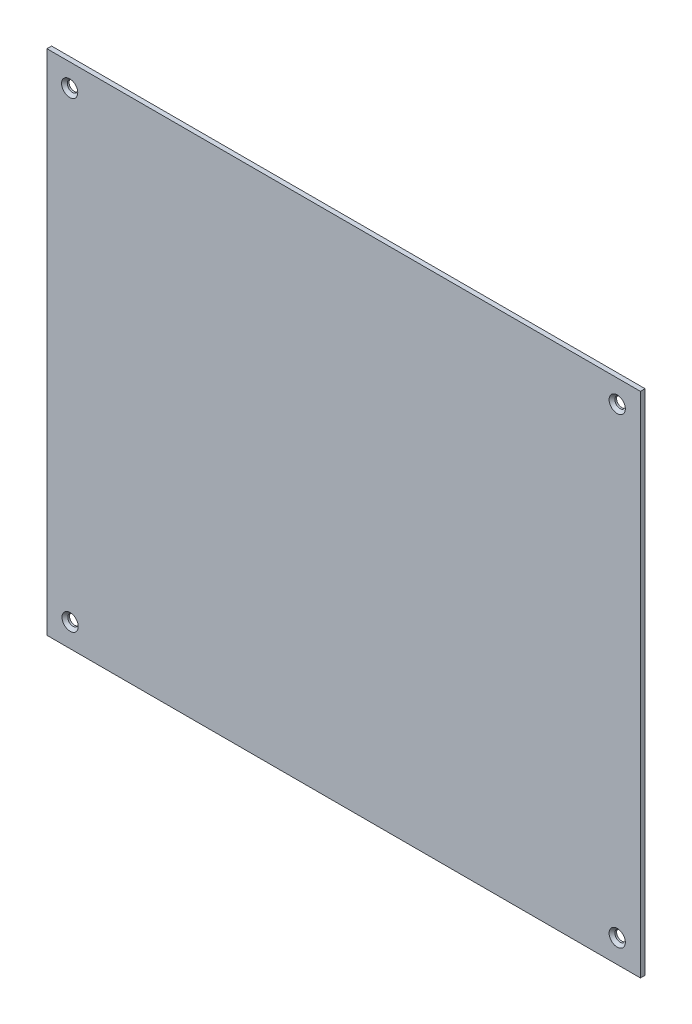
ISO-10303-21;
HEADER;
FILE_DESCRIPTION(('STEP AP214'),'2;1');
FILE_NAME('part.step','',(''),(''),'','','');
FILE_SCHEMA(('AUTOMOTIVE_DESIGN { 1 0 10303 214 1 1 1 1 }'));
ENDSEC;
DATA;
#1=APPLICATION_CONTEXT('core data for automotive mechanical design processes');
#2=APPLICATION_PROTOCOL_DEFINITION('international standard','automotive_design',2000,#1);
#3=PRODUCT_CONTEXT('',#1,'mechanical');
#4=PRODUCT('Part','Part','',(#3));
#5=PRODUCT_RELATED_PRODUCT_CATEGORY('part','',(#4));
#6=PRODUCT_DEFINITION_FORMATION('','',#4);
#7=PRODUCT_DEFINITION_CONTEXT('part definition',#1,'design');
#8=PRODUCT_DEFINITION('design','',#6,#7);
#9=PRODUCT_DEFINITION_SHAPE('','',#8);
#10=(LENGTH_UNIT() NAMED_UNIT(*) SI_UNIT(.MILLI.,.METRE.));
#11=(NAMED_UNIT(*) PLANE_ANGLE_UNIT() SI_UNIT($,.RADIAN.));
#12=(NAMED_UNIT(*) SI_UNIT($,.STERADIAN.) SOLID_ANGLE_UNIT());
#13=UNCERTAINTY_MEASURE_WITH_UNIT(LENGTH_MEASURE(1.E-05),#10,'distance_accuracy_value','');
#14=(GEOMETRIC_REPRESENTATION_CONTEXT(3) GLOBAL_UNCERTAINTY_ASSIGNED_CONTEXT((#13)) GLOBAL_UNIT_ASSIGNED_CONTEXT((#10,
#11,#12)) REPRESENTATION_CONTEXT('',''));
#15=CARTESIAN_POINT('',(0.,0.,0.));
#16=DIRECTION('',(0.,0.,1.));
#17=DIRECTION('',(1.,0.,0.));
#18=AXIS2_PLACEMENT_3D('',#15,#16,#17);
#19=CARTESIAN_POINT('',(0.,0.,1.905));
#20=DIRECTION('',(0.,0.,-1.));
#21=DIRECTION('',(-1.,0.,0.));
#22=AXIS2_PLACEMENT_3D('',#19,#20,#21);
#23=PLANE('',#22);
#24=DIRECTION('',(0.,-1.,0.));
#25=VECTOR('',#24,1.);
#26=CARTESIAN_POINT('',(0.,0.,1.905));
#27=LINE('',#26,#25);
#28=CARTESIAN_POINT('',(0.,208.28,1.905));
#29=VERTEX_POINT('',#28);
#30=CARTESIAN_POINT('',(0.,0.,1.905));
#31=VERTEX_POINT('',#30);
#32=EDGE_CURVE('E91',#29,#31,#27,.T.);
#33=ORIENTED_EDGE('',*,*,#32,.T.);
#34=DIRECTION('',(1.,0.,0.));
#35=VECTOR('',#34,1.);
#36=CARTESIAN_POINT('',(0.,0.,1.905));
#37=LINE('',#36,#35);
#38=CARTESIAN_POINT('',(243.332,0.,1.905));
#39=VERTEX_POINT('',#38);
#40=EDGE_CURVE('E86',#31,#39,#37,.T.);
#41=ORIENTED_EDGE('',*,*,#40,.T.);
#42=DIRECTION('',(0.,1.,0.));
#43=VECTOR('',#42,1.);
#44=CARTESIAN_POINT('',(243.332,0.,1.905));
#45=LINE('',#44,#43);
#46=CARTESIAN_POINT('',(243.332,208.28,1.905));
#47=VERTEX_POINT('',#46);
#48=EDGE_CURVE('E89',#39,#47,#45,.T.);
#49=ORIENTED_EDGE('',*,*,#48,.T.);
#50=DIRECTION('',(-1.,0.,0.));
#51=VECTOR('',#50,1.);
#52=CARTESIAN_POINT('',(0.,208.28,1.905));
#53=LINE('',#52,#51);
#54=EDGE_CURVE('E56',#47,#29,#53,.T.);
#55=ORIENTED_EDGE('',*,*,#54,.T.);
#56=EDGE_LOOP('',(#33,#41,#49,#55));
#57=FACE_BOUND('',#56,.T.);
#58=CARTESIAN_POINT('',(233.807,198.955000999999,1.905));
#59=DIRECTION('',(0.,0.,1.));
#60=DIRECTION('',(1.,0.,0.));
#61=AXIS2_PLACEMENT_3D('',#58,#59,#60);
#62=CIRCLE('',#61,3.32740000000001);
#63=CARTESIAN_POINT('',(237.1344,198.955000999999,1.905));
#64=VERTEX_POINT('',#63);
#65=EDGE_CURVE('E122',#64,#64,#62,.T.);
#66=ORIENTED_EDGE('',*,*,#65,.F.);
#67=EDGE_LOOP('',(#66));
#68=FACE_BOUND('',#67,.T.);
#69=CARTESIAN_POINT('',(9.525,9.525,1.905));
#70=DIRECTION('',(0.,0.,1.));
#71=DIRECTION('',(1.,0.,0.));
#72=AXIS2_PLACEMENT_3D('',#69,#70,#71);
#73=CIRCLE('',#72,3.3274);
#74=CARTESIAN_POINT('',(12.8524,9.525,1.905));
#75=VERTEX_POINT('',#74);
#76=EDGE_CURVE('E131',#75,#75,#73,.T.);
#77=ORIENTED_EDGE('',*,*,#76,.F.);
#78=EDGE_LOOP('',(#77));
#79=FACE_BOUND('',#78,.T.);
#80=CARTESIAN_POINT('',(233.807,9.525,1.905));
#81=DIRECTION('',(0.,0.,1.));
#82=DIRECTION('',(1.,0.,0.));
#83=AXIS2_PLACEMENT_3D('',#80,#81,#82);
#84=CIRCLE('',#83,3.32740000000001);
#85=CARTESIAN_POINT('',(237.1344,9.525,1.905));
#86=VERTEX_POINT('',#85);
#87=EDGE_CURVE('E140',#86,#86,#84,.T.);
#88=ORIENTED_EDGE('',*,*,#87,.F.);
#89=EDGE_LOOP('',(#88));
#90=FACE_BOUND('',#89,.T.);
#91=CARTESIAN_POINT('',(9.32499900000117,198.955000999999,1.905));
#92=DIRECTION('',(0.,0.,1.));
#93=DIRECTION('',(1.,0.,0.));
#94=AXIS2_PLACEMENT_3D('',#91,#92,#93);
#95=CIRCLE('',#94,3.3274);
#96=CARTESIAN_POINT('',(12.6523990000012,198.955000999999,1.905));
#97=VERTEX_POINT('',#96);
#98=EDGE_CURVE('E149',#97,#97,#95,.T.);
#99=ORIENTED_EDGE('',*,*,#98,.F.);
#100=EDGE_LOOP('',(#99));
#101=FACE_BOUND('',#100,.T.);
#102=ADVANCED_FACE('F39',(#57,#68,#79,#90,#101),#23,.F.);
#103=CARTESIAN_POINT('',(0.,0.,1.905));
#104=DIRECTION('',(1.,0.,0.));
#105=DIRECTION('',(0.,0.,-1.));
#106=AXIS2_PLACEMENT_3D('',#103,#104,#105);
#107=PLANE('',#106);
#108=DIRECTION('',(0.,-1.,0.));
#109=VECTOR('',#108,1.);
#110=CARTESIAN_POINT('',(0.,0.,0.));
#111=LINE('',#110,#109);
#112=CARTESIAN_POINT('',(0.,208.28,0.));
#113=VERTEX_POINT('',#112);
#114=CARTESIAN_POINT('',(0.,0.,0.));
#115=VERTEX_POINT('',#114);
#116=EDGE_CURVE('E103',#113,#115,#111,.T.);
#117=ORIENTED_EDGE('',*,*,#116,.T.);
#118=DIRECTION('',(0.,0.,-1.));
#119=VECTOR('',#118,1.);
#120=CARTESIAN_POINT('',(0.,0.,1.905));
#121=LINE('',#120,#119);
#122=EDGE_CURVE('E11',#31,#115,#121,.T.);
#123=ORIENTED_EDGE('',*,*,#122,.F.);
#124=ORIENTED_EDGE('',*,*,#32,.F.);
#125=DIRECTION('',(0.,0.,-1.));
#126=VECTOR('',#125,1.);
#127=CARTESIAN_POINT('',(0.,208.28,1.905));
#128=LINE('',#127,#126);
#129=EDGE_CURVE('E99',#29,#113,#128,.T.);
#130=ORIENTED_EDGE('',*,*,#129,.T.);
#131=EDGE_LOOP('',(#117,#123,#124,#130));
#132=FACE_BOUND('',#131,.T.);
#133=ADVANCED_FACE('F41',(#132),#107,.F.);
#134=CARTESIAN_POINT('',(0.,0.,1.905));
#135=DIRECTION('',(0.,1.,0.));
#136=DIRECTION('',(0.,0.,1.));
#137=AXIS2_PLACEMENT_3D('',#134,#135,#136);
#138=PLANE('',#137);
#139=DIRECTION('',(1.,0.,0.));
#140=VECTOR('',#139,1.);
#141=CARTESIAN_POINT('',(0.,0.,0.));
#142=LINE('',#141,#140);
#143=CARTESIAN_POINT('',(243.332,0.,0.));
#144=VERTEX_POINT('',#143);
#145=EDGE_CURVE('E95',#115,#144,#142,.T.);
#146=ORIENTED_EDGE('',*,*,#145,.T.);
#147=DIRECTION('',(0.,0.,-1.));
#148=VECTOR('',#147,1.);
#149=CARTESIAN_POINT('',(243.332,0.,1.905));
#150=LINE('',#149,#148);
#151=EDGE_CURVE('E48',#39,#144,#150,.T.);
#152=ORIENTED_EDGE('',*,*,#151,.F.);
#153=ORIENTED_EDGE('',*,*,#40,.F.);
#154=ORIENTED_EDGE('',*,*,#122,.T.);
#155=EDGE_LOOP('',(#146,#152,#153,#154));
#156=FACE_BOUND('',#155,.T.);
#157=ADVANCED_FACE('F94',(#156),#138,.F.);
#158=CARTESIAN_POINT('',(243.332,0.,1.905));
#159=DIRECTION('',(-1.,0.,0.));
#160=DIRECTION('',(0.,0.,1.));
#161=AXIS2_PLACEMENT_3D('',#158,#159,#160);
#162=PLANE('',#161);
#163=DIRECTION('',(0.,1.,0.));
#164=VECTOR('',#163,1.);
#165=CARTESIAN_POINT('',(243.332,0.,0.));
#166=LINE('',#165,#164);
#167=CARTESIAN_POINT('',(243.332,208.28,0.));
#168=VERTEX_POINT('',#167);
#169=EDGE_CURVE('E73',#144,#168,#166,.T.);
#170=ORIENTED_EDGE('',*,*,#169,.T.);
#171=DIRECTION('',(0.,0.,-1.));
#172=VECTOR('',#171,1.);
#173=CARTESIAN_POINT('',(243.332,208.28,1.905));
#174=LINE('',#173,#172);
#175=EDGE_CURVE('E96',#47,#168,#174,.T.);
#176=ORIENTED_EDGE('',*,*,#175,.F.);
#177=ORIENTED_EDGE('',*,*,#48,.F.);
#178=ORIENTED_EDGE('',*,*,#151,.T.);
#179=EDGE_LOOP('',(#170,#176,#177,#178));
#180=FACE_BOUND('',#179,.T.);
#181=ADVANCED_FACE('F97',(#180),#162,.F.);
#182=CARTESIAN_POINT('',(0.,208.28,1.905));
#183=DIRECTION('',(0.,-1.,0.));
#184=DIRECTION('',(0.,0.,-1.));
#185=AXIS2_PLACEMENT_3D('',#182,#183,#184);
#186=PLANE('',#185);
#187=DIRECTION('',(-1.,0.,0.));
#188=VECTOR('',#187,1.);
#189=CARTESIAN_POINT('',(0.,208.28,0.));
#190=LINE('',#189,#188);
#191=EDGE_CURVE('E79',#168,#113,#190,.T.);
#192=ORIENTED_EDGE('',*,*,#191,.T.);
#193=ORIENTED_EDGE('',*,*,#129,.F.);
#194=ORIENTED_EDGE('',*,*,#54,.F.);
#195=ORIENTED_EDGE('',*,*,#175,.T.);
#196=EDGE_LOOP('',(#192,#193,#194,#195));
#197=FACE_BOUND('',#196,.T.);
#198=ADVANCED_FACE('F111',(#197),#186,.F.);
#199=CARTESIAN_POINT('',(0.,0.,0.));
#200=DIRECTION('',(0.,0.,-1.));
#201=DIRECTION('',(-1.,0.,0.));
#202=AXIS2_PLACEMENT_3D('',#199,#200,#201);
#203=PLANE('',#202);
#204=CARTESIAN_POINT('',(9.32499900000117,198.955000999999,0.));
#205=DIRECTION('',(0.,0.,-1.));
#206=DIRECTION('',(-1.,0.,0.));
#207=AXIS2_PLACEMENT_3D('',#204,#205,#206);
#208=CIRCLE('',#207,2.15265);
#209=CARTESIAN_POINT('',(7.17234900000117,198.955000999999,0.));
#210=VERTEX_POINT('',#209);
#211=EDGE_CURVE('E143',#210,#210,#208,.T.);
#212=ORIENTED_EDGE('',*,*,#211,.F.);
#213=EDGE_LOOP('',(#212));
#214=FACE_BOUND('',#213,.T.);
#215=CARTESIAN_POINT('',(233.807,9.525,0.));
#216=DIRECTION('',(0.,0.,-1.));
#217=DIRECTION('',(-1.,0.,0.));
#218=AXIS2_PLACEMENT_3D('',#215,#216,#217);
#219=CIRCLE('',#218,2.15265000000001);
#220=CARTESIAN_POINT('',(231.65435,9.525,0.));
#221=VERTEX_POINT('',#220);
#222=EDGE_CURVE('E134',#221,#221,#219,.T.);
#223=ORIENTED_EDGE('',*,*,#222,.F.);
#224=EDGE_LOOP('',(#223));
#225=FACE_BOUND('',#224,.T.);
#226=CARTESIAN_POINT('',(9.525,9.525,0.));
#227=DIRECTION('',(0.,0.,-1.));
#228=DIRECTION('',(-1.,0.,0.));
#229=AXIS2_PLACEMENT_3D('',#226,#227,#228);
#230=CIRCLE('',#229,2.15265);
#231=CARTESIAN_POINT('',(7.37235,9.525,0.));
#232=VERTEX_POINT('',#231);
#233=EDGE_CURVE('E125',#232,#232,#230,.T.);
#234=ORIENTED_EDGE('',*,*,#233,.F.);
#235=EDGE_LOOP('',(#234));
#236=FACE_BOUND('',#235,.T.);
#237=CARTESIAN_POINT('',(233.807,198.955000999999,0.));
#238=DIRECTION('',(0.,0.,-1.));
#239=DIRECTION('',(-1.,0.,0.));
#240=AXIS2_PLACEMENT_3D('',#237,#238,#239);
#241=CIRCLE('',#240,2.15265000000001);
#242=CARTESIAN_POINT('',(231.65435,198.955000999999,0.));
#243=VERTEX_POINT('',#242);
#244=EDGE_CURVE('E106',#243,#243,#241,.T.);
#245=ORIENTED_EDGE('',*,*,#244,.F.);
#246=EDGE_LOOP('',(#245));
#247=FACE_BOUND('',#246,.T.);
#248=ORIENTED_EDGE('',*,*,#116,.F.);
#249=ORIENTED_EDGE('',*,*,#191,.F.);
#250=ORIENTED_EDGE('',*,*,#169,.F.);
#251=ORIENTED_EDGE('',*,*,#145,.F.);
#252=EDGE_LOOP('',(#248,#249,#250,#251));
#253=FACE_BOUND('',#252,.T.);
#254=ADVANCED_FACE('F114',(#214,#225,#236,#247,#253),#203,.T.);
#255=CARTESIAN_POINT('',(233.807,198.955000999999,1.905));
#256=DIRECTION('',(0.,0.,1.));
#257=DIRECTION('',(1.,0.,0.));
#258=AXIS2_PLACEMENT_3D('',#255,#256,#257);
#259=CYLINDRICAL_SURFACE('',#258,2.15265000000001);
#260=CARTESIAN_POINT('',(233.807,198.955000999999,0.73025));
#261=DIRECTION('',(0.,0.,1.));
#262=DIRECTION('',(1.,0.,0.));
#263=AXIS2_PLACEMENT_3D('',#260,#261,#262);
#264=CIRCLE('',#263,2.15265000000001);
#265=CARTESIAN_POINT('',(235.95965,198.955000999999,0.73025));
#266=VERTEX_POINT('',#265);
#267=EDGE_CURVE('E119',#266,#266,#264,.T.);
#268=ORIENTED_EDGE('',*,*,#267,.T.);
#269=EDGE_LOOP('',(#268));
#270=FACE_BOUND('',#269,.T.);
#271=ORIENTED_EDGE('',*,*,#244,.T.);
#272=EDGE_LOOP('',(#271));
#273=FACE_BOUND('',#272,.T.);
#274=ADVANCED_FACE('F164',(#270,#273),#259,.F.);
#275=CARTESIAN_POINT('',(233.807,198.955000999999,1.905));
#276=DIRECTION('',(0.,0.,1.));
#277=DIRECTION('',(1.,0.,0.));
#278=AXIS2_PLACEMENT_3D('',#275,#276,#277);
#279=CONICAL_SURFACE('',#278,3.32740000000001,0.785398163397449);
#280=ORIENTED_EDGE('',*,*,#267,.F.);
#281=EDGE_LOOP('',(#280));
#282=FACE_BOUND('',#281,.T.);
#283=ORIENTED_EDGE('',*,*,#65,.T.);
#284=EDGE_LOOP('',(#283));
#285=FACE_BOUND('',#284,.T.);
#286=ADVANCED_FACE('F205',(#282,#285),#279,.F.);
#287=CARTESIAN_POINT('',(9.525,9.525,1.905));
#288=DIRECTION('',(0.,0.,1.));
#289=DIRECTION('',(1.,0.,0.));
#290=AXIS2_PLACEMENT_3D('',#287,#288,#289);
#291=CYLINDRICAL_SURFACE('',#290,2.15265);
#292=CARTESIAN_POINT('',(9.525,9.525,0.73025));
#293=DIRECTION('',(0.,0.,1.));
#294=DIRECTION('',(1.,0.,0.));
#295=AXIS2_PLACEMENT_3D('',#292,#293,#294);
#296=CIRCLE('',#295,2.15265);
#297=CARTESIAN_POINT('',(11.67765,9.525,0.73025));
#298=VERTEX_POINT('',#297);
#299=EDGE_CURVE('E128',#298,#298,#296,.T.);
#300=ORIENTED_EDGE('',*,*,#299,.T.);
#301=EDGE_LOOP('',(#300));
#302=FACE_BOUND('',#301,.T.);
#303=ORIENTED_EDGE('',*,*,#233,.T.);
#304=EDGE_LOOP('',(#303));
#305=FACE_BOUND('',#304,.T.);
#306=ADVANCED_FACE('F214',(#302,#305),#291,.F.);
#307=CARTESIAN_POINT('',(9.525,9.525,1.905));
#308=DIRECTION('',(0.,0.,1.));
#309=DIRECTION('',(1.,0.,0.));
#310=AXIS2_PLACEMENT_3D('',#307,#308,#309);
#311=CONICAL_SURFACE('',#310,3.3274,0.785398163397448);
#312=ORIENTED_EDGE('',*,*,#299,.F.);
#313=EDGE_LOOP('',(#312));
#314=FACE_BOUND('',#313,.T.);
#315=ORIENTED_EDGE('',*,*,#76,.T.);
#316=EDGE_LOOP('',(#315));
#317=FACE_BOUND('',#316,.T.);
#318=ADVANCED_FACE('F223',(#314,#317),#311,.F.);
#319=CARTESIAN_POINT('',(233.807,9.525,1.905));
#320=DIRECTION('',(0.,0.,1.));
#321=DIRECTION('',(1.,0.,0.));
#322=AXIS2_PLACEMENT_3D('',#319,#320,#321);
#323=CYLINDRICAL_SURFACE('',#322,2.15265000000001);
#324=CARTESIAN_POINT('',(233.807,9.525,0.73025));
#325=DIRECTION('',(0.,0.,1.));
#326=DIRECTION('',(1.,0.,0.));
#327=AXIS2_PLACEMENT_3D('',#324,#325,#326);
#328=CIRCLE('',#327,2.15265000000001);
#329=CARTESIAN_POINT('',(235.95965,9.525,0.73025));
#330=VERTEX_POINT('',#329);
#331=EDGE_CURVE('E137',#330,#330,#328,.T.);
#332=ORIENTED_EDGE('',*,*,#331,.T.);
#333=EDGE_LOOP('',(#332));
#334=FACE_BOUND('',#333,.T.);
#335=ORIENTED_EDGE('',*,*,#222,.T.);
#336=EDGE_LOOP('',(#335));
#337=FACE_BOUND('',#336,.T.);
#338=ADVANCED_FACE('F233',(#334,#337),#323,.F.);
#339=CARTESIAN_POINT('',(233.807,9.525,1.905));
#340=DIRECTION('',(0.,0.,1.));
#341=DIRECTION('',(1.,0.,0.));
#342=AXIS2_PLACEMENT_3D('',#339,#340,#341);
#343=CONICAL_SURFACE('',#342,3.32740000000001,0.785398163397449);
#344=ORIENTED_EDGE('',*,*,#331,.F.);
#345=EDGE_LOOP('',(#344));
#346=FACE_BOUND('',#345,.T.);
#347=ORIENTED_EDGE('',*,*,#87,.T.);
#348=EDGE_LOOP('',(#347));
#349=FACE_BOUND('',#348,.T.);
#350=ADVANCED_FACE('F243',(#346,#349),#343,.F.);
#351=CARTESIAN_POINT('',(9.32499900000117,198.955000999999,1.905));
#352=DIRECTION('',(0.,0.,1.));
#353=DIRECTION('',(1.,0.,0.));
#354=AXIS2_PLACEMENT_3D('',#351,#352,#353);
#355=CYLINDRICAL_SURFACE('',#354,2.15265);
#356=CARTESIAN_POINT('',(9.32499900000117,198.955000999999,0.73025));
#357=DIRECTION('',(0.,0.,1.));
#358=DIRECTION('',(1.,0.,0.));
#359=AXIS2_PLACEMENT_3D('',#356,#357,#358);
#360=CIRCLE('',#359,2.15265);
#361=CARTESIAN_POINT('',(11.4776490000012,198.955000999999,0.73025));
#362=VERTEX_POINT('',#361);
#363=EDGE_CURVE('E146',#362,#362,#360,.T.);
#364=ORIENTED_EDGE('',*,*,#363,.T.);
#365=EDGE_LOOP('',(#364));
#366=FACE_BOUND('',#365,.T.);
#367=ORIENTED_EDGE('',*,*,#211,.T.);
#368=EDGE_LOOP('',(#367));
#369=FACE_BOUND('',#368,.T.);
#370=ADVANCED_FACE('F253',(#366,#369),#355,.F.);
#371=CARTESIAN_POINT('',(9.32499900000117,198.955000999999,1.905));
#372=DIRECTION('',(0.,0.,1.));
#373=DIRECTION('',(1.,0.,0.));
#374=AXIS2_PLACEMENT_3D('',#371,#372,#373);
#375=CONICAL_SURFACE('',#374,3.3274,0.785398163397448);
#376=ORIENTED_EDGE('',*,*,#363,.F.);
#377=EDGE_LOOP('',(#376));
#378=FACE_BOUND('',#377,.T.);
#379=ORIENTED_EDGE('',*,*,#98,.T.);
#380=EDGE_LOOP('',(#379));
#381=FACE_BOUND('',#380,.T.);
#382=ADVANCED_FACE('F153',(#378,#381),#375,.F.);
#383=CLOSED_SHELL('',(#102,#133,#157,#181,#198,#254,#274,#286,#306,#318,#338,#350,#370,#382));
#384=MANIFOLD_SOLID_BREP('B2',#383);
#385=ADVANCED_BREP_SHAPE_REPRESENTATION('',(#18,#384),#14);
#386=SHAPE_DEFINITION_REPRESENTATION(#9,#385);
ENDSEC;
END-ISO-10303-21;
